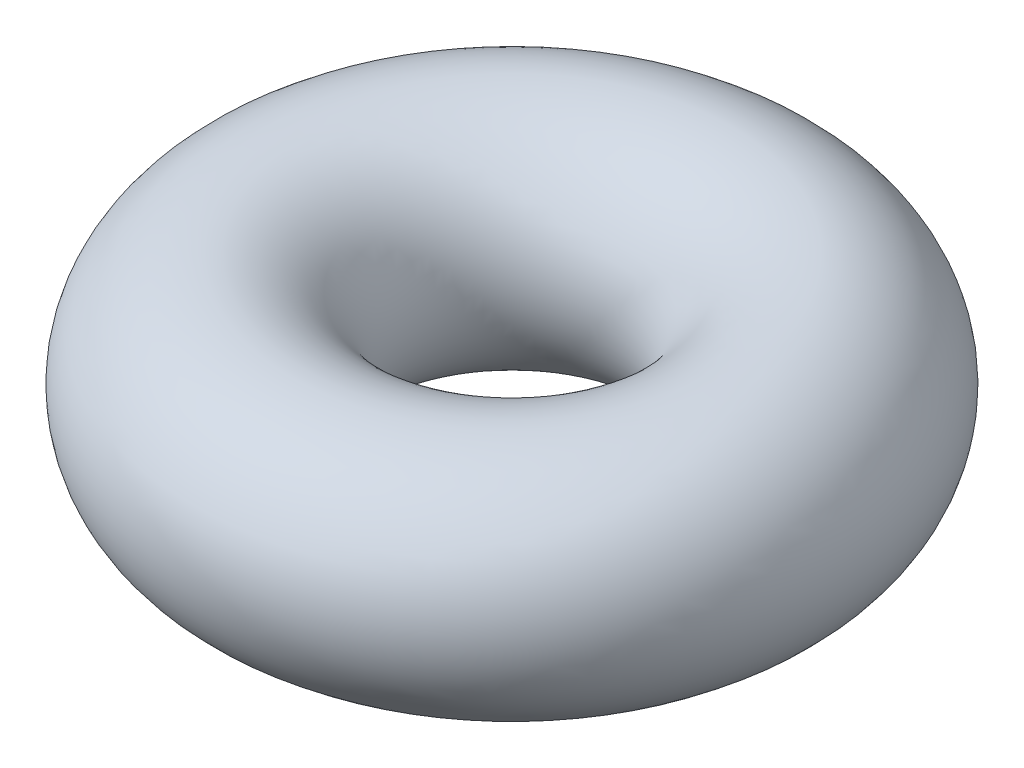
ISO-10303-21;
HEADER;
FILE_DESCRIPTION(('STEP AP214'),'2;1');
FILE_NAME('part.step','',(''),(''),'','','');
FILE_SCHEMA(('AUTOMOTIVE_DESIGN { 1 0 10303 214 1 1 1 1 }'));
ENDSEC;
DATA;
#1=APPLICATION_CONTEXT('core data for automotive mechanical design processes');
#2=APPLICATION_PROTOCOL_DEFINITION('international standard','automotive_design',2000,#1);
#3=PRODUCT_CONTEXT('',#1,'mechanical');
#4=PRODUCT('Part','Part','',(#3));
#5=PRODUCT_RELATED_PRODUCT_CATEGORY('part','',(#4));
#6=PRODUCT_DEFINITION_FORMATION('','',#4);
#7=PRODUCT_DEFINITION_CONTEXT('part definition',#1,'design');
#8=PRODUCT_DEFINITION('design','',#6,#7);
#9=PRODUCT_DEFINITION_SHAPE('','',#8);
#10=(LENGTH_UNIT() NAMED_UNIT(*) SI_UNIT(.MILLI.,.METRE.));
#11=(NAMED_UNIT(*) PLANE_ANGLE_UNIT() SI_UNIT($,.RADIAN.));
#12=(NAMED_UNIT(*) SI_UNIT($,.STERADIAN.) SOLID_ANGLE_UNIT());
#13=UNCERTAINTY_MEASURE_WITH_UNIT(LENGTH_MEASURE(1.E-05),#10,'distance_accuracy_value','');
#14=(GEOMETRIC_REPRESENTATION_CONTEXT(3) GLOBAL_UNCERTAINTY_ASSIGNED_CONTEXT((#13)) GLOBAL_UNIT_ASSIGNED_CONTEXT((#10,
#11,#12)) REPRESENTATION_CONTEXT('',''));
#15=CARTESIAN_POINT('',(0.,0.,0.));
#16=DIRECTION('',(0.,0.,1.));
#17=DIRECTION('',(1.,0.,0.));
#18=AXIS2_PLACEMENT_3D('',#15,#16,#17);
#19=CARTESIAN_POINT('',(0.,0.,0.));
#20=DIRECTION('',(0.,-1.,0.));
#21=DIRECTION('',(0.,0.,-1.));
#22=AXIS2_PLACEMENT_3D('',#19,#20,#21);
#23=TOROIDAL_SURFACE('',#22,59.8386582350369,31.8594813405635);
#24=CARTESIAN_POINT('',(0.,0.,-91.6981395756004));
#25=VERTEX_POINT('',#24);
#26=VERTEX_LOOP('',#25);
#27=FACE_BOUND('',#26,.T.);
#28=ADVANCED_FACE('F36',(#27),#23,.T.);
#29=CLOSED_SHELL('',(#28));
#30=CARTESIAN_POINT('',(0.,0.,0.));
#31=DIRECTION('',(0.,-1.,0.));
#32=DIRECTION('',(0.,0.,-1.));
#33=AXIS2_PLACEMENT_3D('',#30,#31,#32);
#34=TOROIDAL_SURFACE('',#33,59.8386582350369,21.8594813405635);
#35=CARTESIAN_POINT('',(0.,0.,-81.6981395756004));
#36=VERTEX_POINT('',#35);
#37=VERTEX_LOOP('',#36);
#38=FACE_BOUND('',#37,.T.);
#39=ADVANCED_FACE('F49',(#38),#34,.F.);
#40=CLOSED_SHELL('',(#39));
#41=ORIENTED_CLOSED_SHELL('',*,#40,.T.);
#42=BREP_WITH_VOIDS('B2',#29,(#41));
#43=ADVANCED_BREP_SHAPE_REPRESENTATION('',(#18,#42),#14);
#44=SHAPE_DEFINITION_REPRESENTATION(#9,#43);
ENDSEC;
END-ISO-10303-21;
